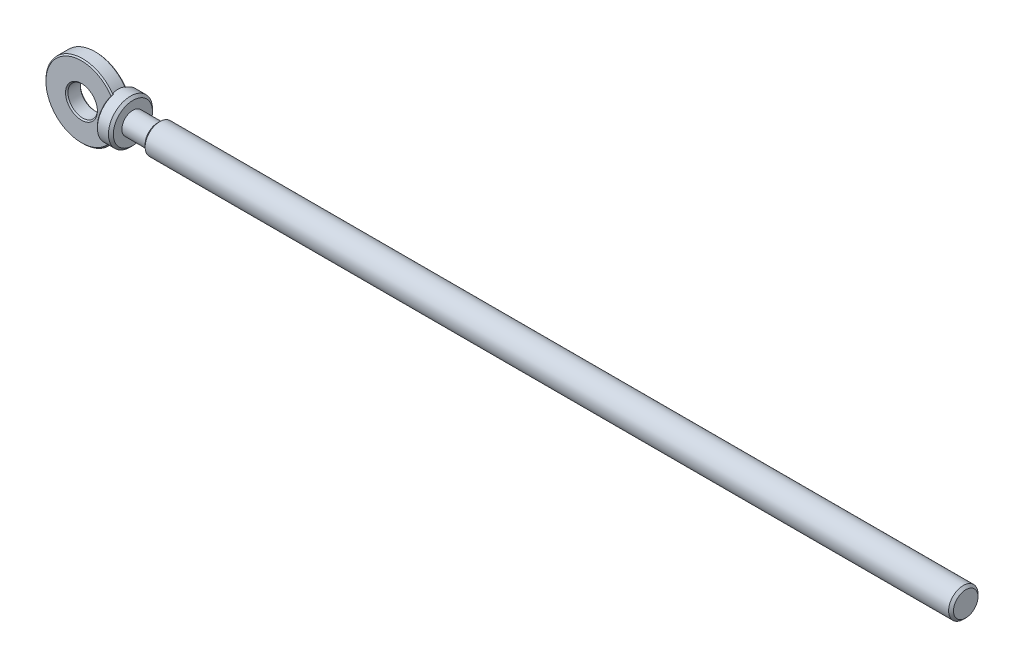
ISO-10303-21;
HEADER;
FILE_DESCRIPTION(('STEP AP214'),'2;1');
FILE_NAME('part.step','',(''),(''),'','','');
FILE_SCHEMA(('AUTOMOTIVE_DESIGN { 1 0 10303 214 1 1 1 1 }'));
ENDSEC;
DATA;
#1=APPLICATION_CONTEXT('core data for automotive mechanical design processes');
#2=APPLICATION_PROTOCOL_DEFINITION('international standard','automotive_design',2000,#1);
#3=PRODUCT_CONTEXT('',#1,'mechanical');
#4=PRODUCT('Part','Part','',(#3));
#5=PRODUCT_RELATED_PRODUCT_CATEGORY('part','',(#4));
#6=PRODUCT_DEFINITION_FORMATION('','',#4);
#7=PRODUCT_DEFINITION_CONTEXT('part definition',#1,'design');
#8=PRODUCT_DEFINITION('design','',#6,#7);
#9=PRODUCT_DEFINITION_SHAPE('','',#8);
#10=(LENGTH_UNIT() NAMED_UNIT(*) SI_UNIT(.MILLI.,.METRE.));
#11=(NAMED_UNIT(*) PLANE_ANGLE_UNIT() SI_UNIT($,.RADIAN.));
#12=(NAMED_UNIT(*) SI_UNIT($,.STERADIAN.) SOLID_ANGLE_UNIT());
#13=UNCERTAINTY_MEASURE_WITH_UNIT(LENGTH_MEASURE(1.E-05),#10,'distance_accuracy_value','');
#14=(GEOMETRIC_REPRESENTATION_CONTEXT(3) GLOBAL_UNCERTAINTY_ASSIGNED_CONTEXT((#13)) GLOBAL_UNIT_ASSIGNED_CONTEXT((#10,
#11,#12)) REPRESENTATION_CONTEXT('',''));
#15=CARTESIAN_POINT('',(0.,0.,0.));
#16=DIRECTION('',(0.,0.,1.));
#17=DIRECTION('',(1.,0.,0.));
#18=AXIS2_PLACEMENT_3D('',#15,#16,#17);
#19=CARTESIAN_POINT('',(0.,0.,3.));
#20=DIRECTION('',(0.,0.,1.));
#21=DIRECTION('',(1.,0.,0.));
#22=AXIS2_PLACEMENT_3D('',#19,#20,#21);
#23=PLANE('',#22);
#24=CARTESIAN_POINT('',(0.,0.,3.));
#25=DIRECTION('',(0.,0.,1.));
#26=DIRECTION('',(1.,0.,0.));
#27=AXIS2_PLACEMENT_3D('',#24,#25,#26);
#28=CIRCLE('',#27,6.50000000000001);
#29=CARTESIAN_POINT('',(6.50000000000001,0.,3.));
#30=VERTEX_POINT('',#29);
#31=EDGE_CURVE('E291',#30,#30,#28,.F.);
#32=ORIENTED_EDGE('',*,*,#31,.T.);
#33=EDGE_LOOP('',(#32));
#34=FACE_BOUND('',#33,.T.);
#35=CARTESIAN_POINT('',(0.,0.,3.));
#36=DIRECTION('',(0.,0.,1.));
#37=DIRECTION('',(1.,0.,0.));
#38=AXIS2_PLACEMENT_3D('',#35,#36,#37);
#39=CIRCLE('',#38,14.5000000000001);
#40=CARTESIAN_POINT('',(12.0729114110313,8.03086608414009,3.));
#41=VERTEX_POINT('',#40);
#42=CARTESIAN_POINT('',(12.0729114110313,-8.03086608414009,3.));
#43=VERTEX_POINT('',#42);
#44=EDGE_CURVE('E138',#41,#43,#39,.T.);
#45=ORIENTED_EDGE('',*,*,#44,.T.);
#46=CARTESIAN_POINT('',(12.,-7.95298686029347,3.));
#47=CARTESIAN_POINT('',(12.2835730188533,-8.25599915961362,3.));
#48=CARTESIAN_POINT('',(12.5681529925396,-8.55806429914531,3.));
#49=CARTESIAN_POINT('',(13.138904051181,-9.16068236188235,3.));
#50=CARTESIAN_POINT('',(13.4250751195812,-9.46123530076007,3.));
#51=CARTESIAN_POINT('',(13.9985830405631,-10.0612085177763,3.));
#52=CARTESIAN_POINT('',(14.2859198586009,-10.3606288289764,3.));
#53=CARTESIAN_POINT('',(14.8615144995009,-10.9585843048844,3.));
#54=CARTESIAN_POINT('',(15.149772325117,-11.2571194669404,3.));
#55=CARTESIAN_POINT('',(16.0156071054011,-12.1516678805662,3.));
#56=CARTESIAN_POINT('',(16.5942601284173,-12.7466394617818,3.));
#57=CARTESIAN_POINT('',(17.4636529352792,-13.637732696402,3.));
#58=CARTESIAN_POINT('',(17.7536903781834,-13.9345407931431,3.));
#59=CARTESIAN_POINT('',(18.3341611916546,-14.5277695303177,3.));
#60=CARTESIAN_POINT('',(18.6245945621705,-14.8241901708012,3.));
#61=CARTESIAN_POINT('',(18.9151897656124,-15.1204522257055,3.));
#62=B_SPLINE_CURVE_WITH_KNOTS('',3,(#46,#47,#48,#49,#50,#51,#52,#53,#54,#55,#56,#57,#58,#59,#60,
#61),.UNSPECIFIED.,.F.,.F.,(4,2,2,2,2,2,2,4),(0.,1.24501113929316,2.4900093486711,
3.7349709313599,4.97993624011984,7.46980285006694,8.71477294002173,9.95974286957087),.UNSPECIFIED.);
#63=CARTESIAN_POINT('',(12.,-7.95298686029347,3.));
#64=VERTEX_POINT('',#63);
#65=EDGE_CURVE('E220',#43,#64,#62,.F.);
#66=ORIENTED_EDGE('',*,*,#65,.T.);
#67=DIRECTION('',(0.,1.,0.));
#68=VECTOR('',#67,1.);
#69=CARTESIAN_POINT('',(12.,0.,3.));
#70=LINE('',#69,#68);
#71=CARTESIAN_POINT('',(12.,7.95298686029347,3.));
#72=VERTEX_POINT('',#71);
#73=EDGE_CURVE('E253',#64,#72,#70,.T.);
#74=ORIENTED_EDGE('',*,*,#73,.T.);
#75=CARTESIAN_POINT('',(12.,7.95298686029347,3.));
#76=CARTESIAN_POINT('',(12.2835730188533,8.25599915961362,3.));
#77=CARTESIAN_POINT('',(12.5681529925396,8.55806429914531,3.));
#78=CARTESIAN_POINT('',(13.138904051181,9.16068236188235,3.));
#79=CARTESIAN_POINT('',(13.4250751195812,9.46123530076007,3.));
#80=CARTESIAN_POINT('',(13.9985830405631,10.0612085177763,3.));
#81=CARTESIAN_POINT('',(14.2859198586009,10.3606288289764,3.));
#82=CARTESIAN_POINT('',(14.8615144995009,10.9585843048844,3.));
#83=CARTESIAN_POINT('',(15.149772325117,11.2571194669404,3.));
#84=CARTESIAN_POINT('',(16.0156071054011,12.1516678805662,3.));
#85=CARTESIAN_POINT('',(16.5942601284173,12.7466394617818,3.));
#86=CARTESIAN_POINT('',(17.4636529352792,13.637732696402,3.));
#87=CARTESIAN_POINT('',(17.7536903781834,13.9345407931431,3.));
#88=CARTESIAN_POINT('',(18.3341611916546,14.5277695303177,3.));
#89=CARTESIAN_POINT('',(18.6245945621705,14.8241901708012,3.));
#90=CARTESIAN_POINT('',(18.9151897656124,15.1204522257055,3.));
#91=B_SPLINE_CURVE_WITH_KNOTS('',3,(#75,#76,#77,#78,#79,#80,#81,#82,#83,#84,#85,#86,#87,#88,#89,
#90),.UNSPECIFIED.,.F.,.F.,(4,2,2,2,2,2,2,4),(0.,1.24501113929316,2.4900093486711,
3.7349709313599,4.97993624011984,7.46980285006694,8.71477294002173,9.95974286957087),.UNSPECIFIED.);
#92=EDGE_CURVE('E227',#72,#41,#91,.T.);
#93=ORIENTED_EDGE('',*,*,#92,.T.);
#94=EDGE_LOOP('',(#45,#66,#74,#93));
#95=FACE_BOUND('',#94,.T.);
#96=ADVANCED_FACE('F33',(#34,#95),#23,.T.);
#97=CARTESIAN_POINT('',(0.,0.,-3.));
#98=DIRECTION('',(0.,0.,1.));
#99=DIRECTION('',(1.,0.,0.));
#100=AXIS2_PLACEMENT_3D('',#97,#98,#99);
#101=PLANE('',#100);
#102=CARTESIAN_POINT('',(0.,0.,-3.));
#103=DIRECTION('',(0.,0.,1.));
#104=DIRECTION('',(1.,0.,0.));
#105=AXIS2_PLACEMENT_3D('',#102,#103,#104);
#106=CIRCLE('',#105,6.50000000000001);
#107=CARTESIAN_POINT('',(6.50000000000001,0.,-3.));
#108=VERTEX_POINT('',#107);
#109=EDGE_CURVE('E134',#108,#108,#106,.T.);
#110=ORIENTED_EDGE('',*,*,#109,.T.);
#111=EDGE_LOOP('',(#110));
#112=FACE_BOUND('',#111,.T.);
#113=DIRECTION('',(0.,1.,0.));
#114=VECTOR('',#113,1.);
#115=CARTESIAN_POINT('',(12.,0.,-3.));
#116=LINE('',#115,#114);
#117=CARTESIAN_POINT('',(12.,-7.95298686029347,-3.));
#118=VERTEX_POINT('',#117);
#119=CARTESIAN_POINT('',(12.,7.95298686029347,-3.));
#120=VERTEX_POINT('',#119);
#121=EDGE_CURVE('E256',#118,#120,#116,.T.);
#122=ORIENTED_EDGE('',*,*,#121,.F.);
#123=CARTESIAN_POINT('',(12.,-7.95298686029347,-3.));
#124=CARTESIAN_POINT('',(12.2835730188533,-8.25599915961362,-3.));
#125=CARTESIAN_POINT('',(12.5681529925396,-8.55806429914531,-3.));
#126=CARTESIAN_POINT('',(13.138904051181,-9.16068236188235,-3.));
#127=CARTESIAN_POINT('',(13.4250751195812,-9.46123530076007,-3.));
#128=CARTESIAN_POINT('',(13.9985830405631,-10.0612085177763,-3.));
#129=CARTESIAN_POINT('',(14.2859198586009,-10.3606288289764,-3.));
#130=CARTESIAN_POINT('',(14.8615144995009,-10.9585843048844,-3.));
#131=CARTESIAN_POINT('',(15.149772325117,-11.2571194669404,-3.));
#132=CARTESIAN_POINT('',(16.0156071054011,-12.1516678805662,-3.));
#133=CARTESIAN_POINT('',(16.5942601284173,-12.7466394617818,-3.));
#134=CARTESIAN_POINT('',(17.4636529352792,-13.637732696402,-3.));
#135=CARTESIAN_POINT('',(17.7536903781834,-13.9345407931431,-3.));
#136=CARTESIAN_POINT('',(18.3341611916546,-14.5277695303177,-3.));
#137=CARTESIAN_POINT('',(18.6245945621705,-14.8241901708012,-3.));
#138=CARTESIAN_POINT('',(18.9151897656124,-15.1204522257055,-3.));
#139=B_SPLINE_CURVE_WITH_KNOTS('',3,(#123,#124,#125,#126,#127,#128,#129,#130,#131,#132,#133,
#134,#135,#136,#137,#138),.UNSPECIFIED.,.F.,.F.,(4,2,2,2,2,2,2,4),(0.,1.24501113929316,
2.4900093486711,3.7349709313599,4.97993624011984,7.46980285006694,8.71477294002173,
9.95974286957087),.UNSPECIFIED.);
#140=CARTESIAN_POINT('',(12.0729114110313,-8.03086608414009,-3.));
#141=VERTEX_POINT('',#140);
#142=EDGE_CURVE('E335',#118,#141,#139,.T.);
#143=ORIENTED_EDGE('',*,*,#142,.T.);
#144=CARTESIAN_POINT('',(0.,0.,-3.));
#145=DIRECTION('',(0.,0.,1.));
#146=DIRECTION('',(1.,0.,0.));
#147=AXIS2_PLACEMENT_3D('',#144,#145,#146);
#148=CIRCLE('',#147,14.5000000000001);
#149=CARTESIAN_POINT('',(12.0729114110313,8.03086608414009,-3.));
#150=VERTEX_POINT('',#149);
#151=EDGE_CURVE('E53',#141,#150,#148,.F.);
#152=ORIENTED_EDGE('',*,*,#151,.T.);
#153=CARTESIAN_POINT('',(12.,7.95298686029347,-3.));
#154=CARTESIAN_POINT('',(12.2835730188533,8.25599915961362,-3.));
#155=CARTESIAN_POINT('',(12.5681529925396,8.55806429914531,-3.));
#156=CARTESIAN_POINT('',(13.138904051181,9.16068236188235,-3.));
#157=CARTESIAN_POINT('',(13.4250751195812,9.46123530076007,-3.));
#158=CARTESIAN_POINT('',(13.9985830405631,10.0612085177763,-3.));
#159=CARTESIAN_POINT('',(14.2859198586009,10.3606288289764,-3.));
#160=CARTESIAN_POINT('',(14.8615144995009,10.9585843048844,-3.));
#161=CARTESIAN_POINT('',(15.149772325117,11.2571194669404,-3.));
#162=CARTESIAN_POINT('',(16.0156071054011,12.1516678805662,-3.));
#163=CARTESIAN_POINT('',(16.5942601284173,12.7466394617818,-3.));
#164=CARTESIAN_POINT('',(17.4636529352792,13.637732696402,-3.));
#165=CARTESIAN_POINT('',(17.7536903781834,13.9345407931431,-3.));
#166=CARTESIAN_POINT('',(18.3341611916546,14.5277695303177,-3.));
#167=CARTESIAN_POINT('',(18.6245945621705,14.8241901708012,-3.));
#168=CARTESIAN_POINT('',(18.9151897656124,15.1204522257055,-3.));
#169=B_SPLINE_CURVE_WITH_KNOTS('',3,(#153,#154,#155,#156,#157,#158,#159,#160,#161,#162,#163,
#164,#165,#166,#167,#168),.UNSPECIFIED.,.F.,.F.,(4,2,2,2,2,2,2,4),(0.,1.24501113929316,
2.4900093486711,3.7349709313599,4.97993624011984,7.46980285006694,8.71477294002173,
9.95974286957087),.UNSPECIFIED.);
#170=EDGE_CURVE('E247',#150,#120,#169,.F.);
#171=ORIENTED_EDGE('',*,*,#170,.T.);
#172=EDGE_LOOP('',(#122,#143,#152,#171));
#173=FACE_BOUND('',#172,.T.);
#174=ADVANCED_FACE('F283',(#112,#173),#101,.F.);
#175=CARTESIAN_POINT('',(0.,0.,3.));
#176=DIRECTION('',(0.,0.,-1.));
#177=DIRECTION('',(-1.,0.,0.));
#178=AXIS2_PLACEMENT_3D('',#175,#176,#177);
#179=CYLINDRICAL_SURFACE('',#178,15.);
#180=CARTESIAN_POINT('',(12.369316876853,-8.48528137423857,3.));
#181=CARTESIAN_POINT('',(12.3221628555619,-8.55399265261305,2.80571556477594));
#182=CARTESIAN_POINT('',(12.2786023029932,-8.61628897871856,2.60822104624012));
#183=CARTESIAN_POINT('',(12.199824844019,-8.72748813543671,2.20773112430477));
#184=CARTESIAN_POINT('',(12.1646135994721,-8.7763818809356,2.00473209153101));
#185=CARTESIAN_POINT('',(12.1038014122272,-8.86005860158778,1.59470774795942));
#186=CARTESIAN_POINT('',(12.0781869679905,-8.89486140659758,1.38768852795889));
#187=CARTESIAN_POINT('',(12.0374151767847,-8.94996230436033,0.970757302326721));
#188=CARTESIAN_POINT('',(12.0222549302426,-8.97026441907619,0.76084611529875));
#189=CARTESIAN_POINT('',(12.0029189827223,-8.99612137426369,0.338691212867915));
#190=CARTESIAN_POINT('',(11.9987910945967,-9.00161202466861,0.126441334819026));
#191=CARTESIAN_POINT('',(12.0018208961828,-8.99757196060952,-0.29783522068331));
#192=CARTESIAN_POINT('',(12.0089786680204,-8.98804113683408,-0.509861896501276));
#193=CARTESIAN_POINT('',(12.0342847045353,-8.95412947896075,-0.931843213909112));
#194=CARTESIAN_POINT('',(12.052422292186,-8.92976307119487,-1.14179966731187));
#195=CARTESIAN_POINT('',(12.0989847192112,-8.86657192779871,-1.55828562884046));
#196=CARTESIAN_POINT('',(12.1274060290411,-8.82775215267245,-1.76481628735148));
#197=CARTESIAN_POINT('',(12.1889463119389,-8.74253723123575,-2.14488592384717));
#198=CARTESIAN_POINT('',(12.2208673858972,-8.69793896895719,-2.31902849990492));
#199=CARTESIAN_POINT('',(12.2907533363521,-8.59889455083059,-2.66289383591663));
#200=CARTESIAN_POINT('',(12.3287068351335,-8.54446690829363,-2.83262423005837));
#201=CARTESIAN_POINT('',(12.369316876853,-8.48528137423857,-3.));
#202=B_SPLINE_CURVE_WITH_KNOTS('',3,(#180,#181,#182,#183,#184,#185,#186,#187,#188,#189,#190,
#191,#192,#193,#194,#195,#196,#197,#198,#199,#200,#201),.UNSPECIFIED.,.F.,.F.,(4,2,2,2,2,2,2,2,
2,2,4),(0.,0.63415362311398,1.2687360584299,1.90242233026116,2.53593277229428,3.17218435016263,
3.80844055806214,4.44407904736948,5.07949958157878,5.62680886083841,6.1730978527989),.UNSPECIFIED.);
#203=CARTESIAN_POINT('',(12.2576506721313,-8.64580823289528,2.50000000000002));
#204=VERTEX_POINT('',#203);
#205=CARTESIAN_POINT('',(12.2576506721313,-8.64580823289529,-2.50000000000001));
#206=VERTEX_POINT('',#205);
#207=EDGE_CURVE('E113',#204,#206,#202,.T.);
#208=ORIENTED_EDGE('',*,*,#207,.F.);
#209=CARTESIAN_POINT('',(0.,0.,2.50000000000002));
#210=DIRECTION('',(0.,0.,1.));
#211=DIRECTION('',(1.,0.,0.));
#212=AXIS2_PLACEMENT_3D('',#209,#210,#211);
#213=CIRCLE('',#212,15.);
#214=CARTESIAN_POINT('',(12.2576506721313,8.64580823289529,2.50000000000002));
#215=VERTEX_POINT('',#214);
#216=EDGE_CURVE('E126',#204,#215,#213,.F.);
#217=ORIENTED_EDGE('',*,*,#216,.T.);
#218=CARTESIAN_POINT('',(12.369316876853,8.48528137423857,-3.));
#219=CARTESIAN_POINT('',(12.3221628555619,8.55399265261305,-2.80571556477594));
#220=CARTESIAN_POINT('',(12.2786023029932,8.61628897871856,-2.60822104624012));
#221=CARTESIAN_POINT('',(12.199824844019,8.72748813543671,-2.20773112430477));
#222=CARTESIAN_POINT('',(12.1646135994721,8.7763818809356,-2.00473209153101));
#223=CARTESIAN_POINT('',(12.1038014122272,8.86005860158778,-1.59470774795942));
#224=CARTESIAN_POINT('',(12.0781869679905,8.89486140659758,-1.38768852795889));
#225=CARTESIAN_POINT('',(12.0374151767847,8.94996230436033,-0.970757302326721));
#226=CARTESIAN_POINT('',(12.0222549302426,8.97026441907619,-0.76084611529875));
#227=CARTESIAN_POINT('',(12.0029189827223,8.99612137426369,-0.338691212867915));
#228=CARTESIAN_POINT('',(11.9987910945967,9.00161202466861,-0.126441334819026));
#229=CARTESIAN_POINT('',(12.0018208961828,8.99757196060952,0.29783522068331));
#230=CARTESIAN_POINT('',(12.0089786680204,8.98804113683408,0.509861896501276));
#231=CARTESIAN_POINT('',(12.0342847045353,8.95412947896075,0.931843213909112));
#232=CARTESIAN_POINT('',(12.052422292186,8.92976307119487,1.14179966731187));
#233=CARTESIAN_POINT('',(12.0989847192112,8.86657192779871,1.55828562884046));
#234=CARTESIAN_POINT('',(12.1274060290411,8.82775215267245,1.76481628735148));
#235=CARTESIAN_POINT('',(12.1889463119389,8.74253723123575,2.14488592384717));
#236=CARTESIAN_POINT('',(12.2208673858972,8.69793896895719,2.31902849990492));
#237=CARTESIAN_POINT('',(12.2907533363521,8.59889455083059,2.66289383591663));
#238=CARTESIAN_POINT('',(12.3287068351335,8.54446690829363,2.83262423005837));
#239=CARTESIAN_POINT('',(12.369316876853,8.48528137423857,3.));
#240=B_SPLINE_CURVE_WITH_KNOTS('',3,(#218,#219,#220,#221,#222,#223,#224,#225,#226,#227,#228,
#229,#230,#231,#232,#233,#234,#235,#236,#237,#238,#239),.UNSPECIFIED.,.F.,.F.,(4,2,2,2,2,2,2,2,
2,2,4),(0.,0.63415362311398,1.2687360584299,1.90242233026116,2.53593277229428,3.17218435016263,
3.80844055806214,4.44407904736948,5.07949958157878,5.62680886083841,6.1730978527989),.UNSPECIFIED.);
#241=CARTESIAN_POINT('',(12.2576506721313,8.64580823289529,-2.50000000000001));
#242=VERTEX_POINT('',#241);
#243=EDGE_CURVE('E129',#242,#215,#240,.T.);
#244=ORIENTED_EDGE('',*,*,#243,.F.);
#245=CARTESIAN_POINT('',(0.,0.,-2.50000000000001));
#246=DIRECTION('',(0.,0.,1.));
#247=DIRECTION('',(1.,0.,0.));
#248=AXIS2_PLACEMENT_3D('',#245,#246,#247);
#249=CIRCLE('',#248,15.);
#250=EDGE_CURVE('E127',#242,#206,#249,.T.);
#251=ORIENTED_EDGE('',*,*,#250,.T.);
#252=EDGE_LOOP('',(#208,#217,#244,#251));
#253=FACE_BOUND('',#252,.T.);
#254=ADVANCED_FACE('F124',(#253),#179,.T.);
#255=CARTESIAN_POINT('',(0.,0.,3.));
#256=DIRECTION('',(0.,0.,-1.));
#257=DIRECTION('',(-1.,0.,0.));
#258=AXIS2_PLACEMENT_3D('',#255,#256,#257);
#259=CYLINDRICAL_SURFACE('',#258,6.);
#260=CARTESIAN_POINT('',(0.,0.,2.49999999999997));
#261=DIRECTION('',(0.,0.,1.));
#262=DIRECTION('',(1.,0.,0.));
#263=AXIS2_PLACEMENT_3D('',#260,#261,#262);
#264=CIRCLE('',#263,6.);
#265=CARTESIAN_POINT('',(6.,0.,2.49999999999997));
#266=VERTEX_POINT('',#265);
#267=EDGE_CURVE('E146',#266,#266,#264,.T.);
#268=ORIENTED_EDGE('',*,*,#267,.T.);
#269=EDGE_LOOP('',(#268));
#270=FACE_BOUND('',#269,.T.);
#271=CARTESIAN_POINT('',(0.,0.,-2.50000000000002));
#272=DIRECTION('',(0.,0.,1.));
#273=DIRECTION('',(1.,0.,0.));
#274=AXIS2_PLACEMENT_3D('',#271,#272,#273);
#275=CIRCLE('',#274,6.);
#276=CARTESIAN_POINT('',(6.,0.,-2.50000000000002));
#277=VERTEX_POINT('',#276);
#278=EDGE_CURVE('E143',#277,#277,#275,.F.);
#279=ORIENTED_EDGE('',*,*,#278,.T.);
#280=EDGE_LOOP('',(#279));
#281=FACE_BOUND('',#280,.T.);
#282=ADVANCED_FACE('F327',(#270,#281),#259,.F.);
#283=CARTESIAN_POINT('',(12.,0.,0.));
#284=DIRECTION('',(1.,0.,0.));
#285=DIRECTION('',(0.,0.,-1.));
#286=AXIS2_PLACEMENT_3D('',#283,#284,#285);
#287=PLANE('',#286);
#288=ORIENTED_EDGE('',*,*,#121,.T.);
#289=CARTESIAN_POINT('',(12.,0.,0.));
#290=DIRECTION('',(1.,0.,0.));
#291=DIRECTION('',(0.,0.,-1.));
#292=AXIS2_PLACEMENT_3D('',#289,#290,#291);
#293=CIRCLE('',#292,8.50000000000003);
#294=EDGE_CURVE('E217',#120,#118,#293,.F.);
#295=ORIENTED_EDGE('',*,*,#294,.T.);
#296=EDGE_LOOP('',(#288,#295));
#297=FACE_BOUND('',#296,.T.);
#298=ADVANCED_FACE('F168',(#297),#287,.F.);
#299=CARTESIAN_POINT('',(-15.,0.,0.));
#300=DIRECTION('',(-1.,0.,0.));
#301=DIRECTION('',(0.,0.,1.));
#302=AXIS2_PLACEMENT_3D('',#299,#300,#301);
#303=CYLINDRICAL_SURFACE('',#302,9.);
#304=CARTESIAN_POINT('',(16.9999999999999,0.,0.));
#305=DIRECTION('',(-1.,0.,0.));
#306=DIRECTION('',(0.,0.,1.));
#307=AXIS2_PLACEMENT_3D('',#304,#305,#306);
#308=CIRCLE('',#307,9.);
#309=CARTESIAN_POINT('',(16.9999999999999,0.,9.));
#310=VERTEX_POINT('',#309);
#311=EDGE_CURVE('E263',#310,#310,#308,.T.);
#312=ORIENTED_EDGE('',*,*,#311,.T.);
#313=EDGE_LOOP('',(#312));
#314=FACE_BOUND('',#313,.T.);
#315=ORIENTED_EDGE('',*,*,#243,.T.);
#316=CARTESIAN_POINT('',(12.5,8.7104716001424,2.2644391144636));
#317=CARTESIAN_POINT('',(12.3938248537652,8.6838676161721,2.36676089310342));
#318=CARTESIAN_POINT('',(12.2884671347018,8.655262333074,2.46940638238641));
#319=CARTESIAN_POINT('',(12.0796156609199,8.59383475884252,2.67536275909698));
#320=CARTESIAN_POINT('',(11.9761222094995,8.5610117884726,2.77867375114921));
#321=CARTESIAN_POINT('',(11.6700683906366,8.45633094038508,3.08833241912403));
#322=CARTESIAN_POINT('',(11.470648073195,8.37794496493001,3.29564002154209));
#323=CARTESIAN_POINT('',(11.0827576913241,8.20171904544879,3.71255099359621));
#324=CARTESIAN_POINT('',(10.8942921538535,8.10387113178587,3.92215527038145));
#325=CARTESIAN_POINT('',(10.621921120078,7.9405635875128,4.23811299076778));
#326=CARTESIAN_POINT('',(10.5326035757586,7.88317755613287,4.34400591341861));
#327=CARTESIAN_POINT('',(10.3580906440943,7.76260691634443,4.55596196467909));
#328=CARTESIAN_POINT('',(10.2728968383347,7.69942010964792,4.66202514272461));
#329=CARTESIAN_POINT('',(10.1900273551833,7.63318956823422,4.76806218661211));
#330=B_SPLINE_CURVE_WITH_KNOTS('',3,(#316,#317,#318,#319,#320,#321,#322,#323,#324,#325,#326,
#327,#328,#329),.UNSPECIFIED.,.F.,.F.,(4,2,2,2,2,2,4),(0.,0.449479872110191,0.899032221544185,
1.7927152217836,2.68676494023106,3.13645457596968,3.58631533719687),.UNSPECIFIED.);
#331=CARTESIAN_POINT('',(12.5,8.7104716001424,2.2644391144636));
#332=VERTEX_POINT('',#331);
#333=EDGE_CURVE('E133',#215,#332,#330,.F.);
#334=ORIENTED_EDGE('',*,*,#333,.T.);
#335=CARTESIAN_POINT('',(12.5,0.,0.));
#336=DIRECTION('',(1.,0.,0.));
#337=DIRECTION('',(0.,0.,-1.));
#338=AXIS2_PLACEMENT_3D('',#335,#336,#337);
#339=CIRCLE('',#338,9.);
#340=CARTESIAN_POINT('',(12.5,-8.42080961678128,3.17647058823529));
#341=VERTEX_POINT('',#340);
#342=EDGE_CURVE('E218',#332,#341,#339,.T.);
#343=ORIENTED_EDGE('',*,*,#342,.T.);
#344=CARTESIAN_POINT('',(12.5,0.,0.));
#345=DIRECTION('',(1.,0.,0.));
#346=DIRECTION('',(0.,0.,-1.));
#347=AXIS2_PLACEMENT_3D('',#344,#345,#346);
#348=CIRCLE('',#347,9.);
#349=CARTESIAN_POINT('',(12.5,-8.7104716001424,2.2644391144636));
#350=VERTEX_POINT('',#349);
#351=EDGE_CURVE('E116',#341,#350,#348,.T.);
#352=ORIENTED_EDGE('',*,*,#351,.T.);
#353=CARTESIAN_POINT('',(12.5,-8.7104716001424,2.2644391144636));
#354=CARTESIAN_POINT('',(12.3938248537652,-8.6838676161721,2.36676089310342));
#355=CARTESIAN_POINT('',(12.2884671347018,-8.655262333074,2.46940638238641));
#356=CARTESIAN_POINT('',(12.0796156609199,-8.59383475884252,2.67536275909698));
#357=CARTESIAN_POINT('',(11.9761222094995,-8.5610117884726,2.77867375114921));
#358=CARTESIAN_POINT('',(11.6700683906366,-8.45633094038508,3.08833241912403));
#359=CARTESIAN_POINT('',(11.470648073195,-8.37794496493001,3.29564002154209));
#360=CARTESIAN_POINT('',(11.0827576913241,-8.20171904544879,3.71255099359621));
#361=CARTESIAN_POINT('',(10.8942921538535,-8.10387113178587,3.92215527038145));
#362=CARTESIAN_POINT('',(10.621921120078,-7.9405635875128,4.23811299076778));
#363=CARTESIAN_POINT('',(10.5326035757586,-7.88317755613287,4.34400591341861));
#364=CARTESIAN_POINT('',(10.3580906440943,-7.76260691634443,4.55596196467909));
#365=CARTESIAN_POINT('',(10.2728968383347,-7.69942010964792,4.66202514272461));
#366=CARTESIAN_POINT('',(10.1900273551833,-7.63318956823422,4.76806218661211));
#367=B_SPLINE_CURVE_WITH_KNOTS('',3,(#353,#354,#355,#356,#357,#358,#359,#360,#361,#362,#363,
#364,#365,#366),.UNSPECIFIED.,.F.,.F.,(4,2,2,2,2,2,4),(0.,0.449479872110191,0.899032221544185,
1.7927152217836,2.68676494023106,3.13645457596968,3.58631533719687),.UNSPECIFIED.);
#368=EDGE_CURVE('E109',#350,#204,#367,.T.);
#369=ORIENTED_EDGE('',*,*,#368,.T.);
#370=ORIENTED_EDGE('',*,*,#207,.T.);
#371=CARTESIAN_POINT('',(12.4999999999998,-8.71047160014236,-2.26443911446374));
#372=CARTESIAN_POINT('',(12.393824853765,-8.68386761617206,-2.36676089310356));
#373=CARTESIAN_POINT('',(12.2884671347017,-8.65526233307396,-2.46940638238655));
#374=CARTESIAN_POINT('',(12.0796156609198,-8.59383475884248,-2.67536275909711));
#375=CARTESIAN_POINT('',(11.9761222094994,-8.56101178847256,-2.77867375114934));
#376=CARTESIAN_POINT('',(11.6700683906365,-8.45633094038504,-3.08833241912414));
#377=CARTESIAN_POINT('',(11.4706480731949,-8.37794496492997,-3.29564002154219));
#378=CARTESIAN_POINT('',(11.082757691324,-8.20171904544875,-3.7125509935963));
#379=CARTESIAN_POINT('',(10.8942921538535,-8.10387113178583,-3.92215527038153));
#380=CARTESIAN_POINT('',(10.621921120078,-7.94056358751277,-4.23811299076785));
#381=CARTESIAN_POINT('',(10.5326035757586,-7.88317755613284,-4.34400591341867));
#382=CARTESIAN_POINT('',(10.3580906440943,-7.7626069163444,-4.55596196467914));
#383=CARTESIAN_POINT('',(10.2728968383347,-7.69942010964789,-4.66202514272466));
#384=CARTESIAN_POINT('',(10.1900273551833,-7.6331895682342,-4.76806218661215));
#385=B_SPLINE_CURVE_WITH_KNOTS('',3,(#371,#372,#373,#374,#375,#376,#377,#378,#379,#380,#381,
#382,#383,#384),.UNSPECIFIED.,.F.,.F.,(4,2,2,2,2,2,4),(0.,0.449479872110169,0.899032221544143,
1.79271522178351,2.68676494023093,3.13645457596952,3.58631533719669),.UNSPECIFIED.);
#386=CARTESIAN_POINT('',(12.4999999999999,-8.71047160014224,-2.26443911446377));
#387=VERTEX_POINT('',#386);
#388=EDGE_CURVE('E60',#206,#387,#385,.F.);
#389=ORIENTED_EDGE('',*,*,#388,.T.);
#390=CARTESIAN_POINT('',(12.5,0.,0.));
#391=DIRECTION('',(1.,0.,0.));
#392=DIRECTION('',(0.,0.,-1.));
#393=AXIS2_PLACEMENT_3D('',#390,#391,#392);
#394=CIRCLE('',#393,9.);
#395=CARTESIAN_POINT('',(12.5,8.42080961678128,-3.17647058823529));
#396=VERTEX_POINT('',#395);
#397=EDGE_CURVE('E346',#387,#396,#394,.T.);
#398=ORIENTED_EDGE('',*,*,#397,.T.);
#399=CARTESIAN_POINT('',(12.5,0.,0.));
#400=DIRECTION('',(1.,0.,0.));
#401=DIRECTION('',(0.,0.,-1.));
#402=AXIS2_PLACEMENT_3D('',#399,#400,#401);
#403=CIRCLE('',#402,9.);
#404=CARTESIAN_POINT('',(12.4999999999998,8.71047160014236,-2.26443911446374));
#405=VERTEX_POINT('',#404);
#406=EDGE_CURVE('E157',#396,#405,#403,.T.);
#407=ORIENTED_EDGE('',*,*,#406,.T.);
#408=CARTESIAN_POINT('',(12.4999999999998,8.71047160014236,-2.26443911446374));
#409=CARTESIAN_POINT('',(12.393824853765,8.68386761617206,-2.36676089310356));
#410=CARTESIAN_POINT('',(12.2884671347017,8.65526233307396,-2.46940638238655));
#411=CARTESIAN_POINT('',(12.0796156609198,8.59383475884248,-2.67536275909711));
#412=CARTESIAN_POINT('',(11.9761222094994,8.56101178847256,-2.77867375114934));
#413=CARTESIAN_POINT('',(11.6700683906365,8.45633094038504,-3.08833241912414));
#414=CARTESIAN_POINT('',(11.4706480731949,8.37794496492997,-3.29564002154219));
#415=CARTESIAN_POINT('',(11.082757691324,8.20171904544875,-3.7125509935963));
#416=CARTESIAN_POINT('',(10.8942921538535,8.10387113178583,-3.92215527038153));
#417=CARTESIAN_POINT('',(10.621921120078,7.94056358751277,-4.23811299076785));
#418=CARTESIAN_POINT('',(10.5326035757586,7.88317755613284,-4.34400591341867));
#419=CARTESIAN_POINT('',(10.3580906440943,7.7626069163444,-4.55596196467914));
#420=CARTESIAN_POINT('',(10.2728968383347,7.69942010964789,-4.66202514272466));
#421=CARTESIAN_POINT('',(10.1900273551833,7.6331895682342,-4.76806218661215));
#422=B_SPLINE_CURVE_WITH_KNOTS('',3,(#408,#409,#410,#411,#412,#413,#414,#415,#416,#417,#418,
#419,#420,#421),.UNSPECIFIED.,.F.,.F.,(4,2,2,2,2,2,4),(0.,0.449479872110169,0.899032221544143,
1.79271522178351,2.68676494023093,3.13645457596952,3.58631533719669),.UNSPECIFIED.);
#423=EDGE_CURVE('E151',#405,#242,#422,.T.);
#424=ORIENTED_EDGE('',*,*,#423,.T.);
#425=EDGE_LOOP('',(#315,#334,#343,#352,#369,#370,#389,#398,#407,#424));
#426=FACE_BOUND('',#425,.T.);
#427=ADVANCED_FACE('F112',(#314,#426),#303,.T.);
#428=ORIENTED_EDGE('',*,*,#73,.F.);
#429=CARTESIAN_POINT('',(12.,0.,0.));
#430=DIRECTION('',(1.,0.,0.));
#431=DIRECTION('',(0.,0.,-1.));
#432=AXIS2_PLACEMENT_3D('',#429,#430,#431);
#433=CIRCLE('',#432,8.50000000000003);
#434=EDGE_CURVE('E149',#64,#72,#433,.F.);
#435=ORIENTED_EDGE('',*,*,#434,.T.);
#436=EDGE_LOOP('',(#428,#435));
#437=FACE_BOUND('',#436,.T.);
#438=ADVANCED_FACE('F167',(#437),#287,.F.);
#439=CARTESIAN_POINT('',(18.,0.,0.));
#440=DIRECTION('',(-1.,0.,0.));
#441=DIRECTION('',(0.,0.,1.));
#442=AXIS2_PLACEMENT_3D('',#439,#440,#441);
#443=PLANE('',#442);
#444=CARTESIAN_POINT('',(18.,0.,0.));
#445=DIRECTION('',(-1.,0.,0.));
#446=DIRECTION('',(0.,0.,1.));
#447=AXIS2_PLACEMENT_3D('',#444,#445,#446);
#448=CIRCLE('',#447,7.99999999999995);
#449=CARTESIAN_POINT('',(18.,0.,7.99999999999995));
#450=VERTEX_POINT('',#449);
#451=EDGE_CURVE('E307',#450,#450,#448,.F.);
#452=ORIENTED_EDGE('',*,*,#451,.T.);
#453=EDGE_LOOP('',(#452));
#454=FACE_BOUND('',#453,.T.);
#455=CARTESIAN_POINT('',(18.,0.,0.));
#456=DIRECTION('',(1.,0.,0.));
#457=DIRECTION('',(0.,0.,-1.));
#458=AXIS2_PLACEMENT_3D('',#455,#456,#457);
#459=CIRCLE('',#458,4.5);
#460=CARTESIAN_POINT('',(18.,0.,-4.5));
#461=VERTEX_POINT('',#460);
#462=EDGE_CURVE('E128',#461,#461,#459,.T.);
#463=ORIENTED_EDGE('',*,*,#462,.F.);
#464=EDGE_LOOP('',(#463));
#465=FACE_BOUND('',#464,.T.);
#466=ADVANCED_FACE('F170',(#454,#465),#443,.F.);
#467=CARTESIAN_POINT('',(28.,0.,0.));
#468=DIRECTION('',(-1.,0.,0.));
#469=DIRECTION('',(0.,0.,1.));
#470=AXIS2_PLACEMENT_3D('',#467,#468,#469);
#471=CYLINDRICAL_SURFACE('',#470,4.5);
#472=CARTESIAN_POINT('',(28.,0.,0.));
#473=DIRECTION('',(1.,0.,0.));
#474=DIRECTION('',(0.,0.,-1.));
#475=AXIS2_PLACEMENT_3D('',#472,#473,#474);
#476=CIRCLE('',#475,4.5);
#477=CARTESIAN_POINT('',(28.,0.,-4.5));
#478=VERTEX_POINT('',#477);
#479=EDGE_CURVE('E258',#478,#478,#476,.T.);
#480=ORIENTED_EDGE('',*,*,#479,.F.);
#481=EDGE_LOOP('',(#480));
#482=FACE_BOUND('',#481,.T.);
#483=ORIENTED_EDGE('',*,*,#462,.T.);
#484=EDGE_LOOP('',(#483));
#485=FACE_BOUND('',#484,.T.);
#486=ADVANCED_FACE('F269',(#482,#485),#471,.T.);
#487=CARTESIAN_POINT('',(358.,0.,0.));
#488=DIRECTION('',(-1.,0.,0.));
#489=DIRECTION('',(0.,0.,1.));
#490=AXIS2_PLACEMENT_3D('',#487,#488,#489);
#491=CYLINDRICAL_SURFACE('',#490,6.);
#492=CARTESIAN_POINT('',(29.,0.,0.));
#493=DIRECTION('',(1.,0.,0.));
#494=DIRECTION('',(0.,0.,-1.));
#495=AXIS2_PLACEMENT_3D('',#492,#493,#494);
#496=CIRCLE('',#495,6.);
#497=CARTESIAN_POINT('',(29.,0.,-6.));
#498=VERTEX_POINT('',#497);
#499=EDGE_CURVE('E301',#498,#498,#496,.T.);
#500=ORIENTED_EDGE('',*,*,#499,.T.);
#501=EDGE_LOOP('',(#500));
#502=FACE_BOUND('',#501,.T.);
#503=CARTESIAN_POINT('',(357.,0.,0.));
#504=DIRECTION('',(1.,0.,0.));
#505=DIRECTION('',(0.,0.,-1.));
#506=AXIS2_PLACEMENT_3D('',#503,#504,#505);
#507=CIRCLE('',#506,6.);
#508=CARTESIAN_POINT('',(357.,0.,-6.));
#509=VERTEX_POINT('',#508);
#510=EDGE_CURVE('E304',#509,#509,#507,.F.);
#511=ORIENTED_EDGE('',*,*,#510,.T.);
#512=EDGE_LOOP('',(#511));
#513=FACE_BOUND('',#512,.T.);
#514=ADVANCED_FACE('F272',(#502,#513),#491,.T.);
#515=CARTESIAN_POINT('',(358.,0.,0.));
#516=DIRECTION('',(1.,0.,0.));
#517=DIRECTION('',(0.,0.,-1.));
#518=AXIS2_PLACEMENT_3D('',#515,#516,#517);
#519=PLANE('',#518);
#520=CARTESIAN_POINT('',(358.,0.,0.));
#521=DIRECTION('',(1.,0.,0.));
#522=DIRECTION('',(0.,0.,-1.));
#523=AXIS2_PLACEMENT_3D('',#520,#521,#522);
#524=CIRCLE('',#523,4.99999999999989);
#525=CARTESIAN_POINT('',(358.,0.,-4.99999999999989));
#526=VERTEX_POINT('',#525);
#527=EDGE_CURVE('E293',#526,#526,#524,.T.);
#528=ORIENTED_EDGE('',*,*,#527,.T.);
#529=EDGE_LOOP('',(#528));
#530=FACE_BOUND('',#529,.T.);
#531=ADVANCED_FACE('F321',(#530),#519,.T.);
#532=CARTESIAN_POINT('',(28.,0.,0.));
#533=DIRECTION('',(1.,0.,0.));
#534=DIRECTION('',(0.,0.,-1.));
#535=AXIS2_PLACEMENT_3D('',#532,#533,#534);
#536=PLANE('',#535);
#537=CARTESIAN_POINT('',(28.,0.,0.));
#538=DIRECTION('',(1.,0.,0.));
#539=DIRECTION('',(0.,0.,-1.));
#540=AXIS2_PLACEMENT_3D('',#537,#538,#539);
#541=CIRCLE('',#540,5.00000000000004);
#542=CARTESIAN_POINT('',(28.,0.,-5.00000000000004));
#543=VERTEX_POINT('',#542);
#544=EDGE_CURVE('E296',#543,#543,#541,.F.);
#545=ORIENTED_EDGE('',*,*,#544,.T.);
#546=EDGE_LOOP('',(#545));
#547=FACE_BOUND('',#546,.T.);
#548=ORIENTED_EDGE('',*,*,#479,.T.);
#549=EDGE_LOOP('',(#548));
#550=FACE_BOUND('',#549,.T.);
#551=ADVANCED_FACE('F267',(#547,#550),#536,.F.);
#552=CARTESIAN_POINT('',(16.9999999999999,0.,0.));
#553=DIRECTION('',(-1.,0.,0.));
#554=DIRECTION('',(0.,0.,1.));
#555=AXIS2_PLACEMENT_3D('',#552,#553,#554);
#556=CONICAL_SURFACE('',#555,9.,0.785398163397437);
#557=ORIENTED_EDGE('',*,*,#451,.F.);
#558=EDGE_LOOP('',(#557));
#559=FACE_BOUND('',#558,.T.);
#560=ORIENTED_EDGE('',*,*,#311,.F.);
#561=EDGE_LOOP('',(#560));
#562=FACE_BOUND('',#561,.T.);
#563=ADVANCED_FACE('F311',(#559,#562),#556,.T.);
#564=CARTESIAN_POINT('',(29.,0.,0.));
#565=DIRECTION('',(1.,0.,0.));
#566=DIRECTION('',(0.,0.,-1.));
#567=AXIS2_PLACEMENT_3D('',#564,#565,#566);
#568=CONICAL_SURFACE('',#567,6.,0.785398163397446);
#569=ORIENTED_EDGE('',*,*,#544,.F.);
#570=EDGE_LOOP('',(#569));
#571=FACE_BOUND('',#570,.T.);
#572=ORIENTED_EDGE('',*,*,#499,.F.);
#573=EDGE_LOOP('',(#572));
#574=FACE_BOUND('',#573,.T.);
#575=ADVANCED_FACE('F313',(#571,#574),#568,.T.);
#576=CARTESIAN_POINT('',(358.,0.,0.));
#577=DIRECTION('',(-1.,0.,0.));
#578=DIRECTION('',(0.,0.,1.));
#579=AXIS2_PLACEMENT_3D('',#576,#577,#578);
#580=CONICAL_SURFACE('',#579,4.99999999999989,0.785398163397474);
#581=ORIENTED_EDGE('',*,*,#510,.F.);
#582=EDGE_LOOP('',(#581));
#583=FACE_BOUND('',#582,.T.);
#584=ORIENTED_EDGE('',*,*,#527,.F.);
#585=EDGE_LOOP('',(#584));
#586=FACE_BOUND('',#585,.T.);
#587=ADVANCED_FACE('F201',(#583,#586),#580,.T.);
#588=CARTESIAN_POINT('',(0.,0.,3.));
#589=DIRECTION('',(0.,0.,-1.));
#590=DIRECTION('',(-1.,0.,0.));
#591=AXIS2_PLACEMENT_3D('',#588,#589,#590);
#592=CONICAL_SURFACE('',#591,14.5000000000001,0.785398163397396);
#593=ORIENTED_EDGE('',*,*,#44,.F.);
#594=CARTESIAN_POINT('',(12.0729114110313,8.03086608414009,3.));
#595=CARTESIAN_POINT('',(12.1329045026837,8.13514334936543,2.89228991966483));
#596=CARTESIAN_POINT('',(12.1944458719282,8.23780477100358,2.78389843178186));
#597=CARTESIAN_POINT('',(12.3204495064789,8.44004057555164,2.56596462378141));
#598=CARTESIAN_POINT('',(12.3849114425692,8.53961530428306,2.45642243443878));
#599=CARTESIAN_POINT('',(12.5823406736015,8.83381973088799,2.12650951178165));
#600=CARTESIAN_POINT('',(12.7194382351543,9.02407931542721,1.90469680763763));
#601=CARTESIAN_POINT('',(13.0025595823457,9.3931542545737,1.45963244563139));
#602=CARTESIAN_POINT('',(13.1485359248168,9.57202150246878,1.23639330991637));
#603=CARTESIAN_POINT('',(13.448816928474,9.92046922976262,0.788216264266412));
#604=CARTESIAN_POINT('',(13.6031230748928,10.0900480420694,0.563278057571744));
#605=CARTESIAN_POINT('',(13.918515730787,10.4204460607906,0.112955091719323));
#606=CARTESIAN_POINT('',(14.0795832927551,10.5812871815645,-0.112426926854899));
#607=CARTESIAN_POINT('',(14.4079223866969,10.8955750072589,-0.563805908149115));
#608=CARTESIAN_POINT('',(14.5751938529406,11.0490217904824,-0.789802864330394));
#609=CARTESIAN_POINT('',(14.9159781215813,11.3500724829918,-1.24327219805333));
#610=CARTESIAN_POINT('',(15.0895183120876,11.4976427525312,-1.47074623878517));
#611=CARTESIAN_POINT('',(15.4413106518131,11.7867591966107,-1.92580166847123));
#612=CARTESIAN_POINT('',(15.6195619397035,11.9283064601522,-2.15338303043268));
#613=CARTESIAN_POINT('',(15.7998400758906,12.0671932080023,-2.38094812485049));
#614=B_SPLINE_CURVE_WITH_KNOTS('',3,(#594,#595,#596,#597,#598,#599,#600,#601,#602,#603,#604,
#605,#606,#607,#608,#609,#610,#611,#612,#613),.UNSPECIFIED.,.F.,.F.,(4,2,2,2,2,2,2,2,2,4),(0.,
0.484387040674871,0.968719614849761,1.93668752645631,2.89987349332478,3.86323177049802,
4.82405034668118,5.78485874596597,6.75054779724661,7.71606149682422),.UNSPECIFIED.);
#615=EDGE_CURVE('E242',#41,#332,#614,.T.);
#616=ORIENTED_EDGE('',*,*,#615,.T.);
#617=ORIENTED_EDGE('',*,*,#333,.F.);
#618=ORIENTED_EDGE('',*,*,#216,.F.);
#619=ORIENTED_EDGE('',*,*,#368,.F.);
#620=CARTESIAN_POINT('',(12.0729114110313,-8.03086608414009,3.));
#621=CARTESIAN_POINT('',(12.1329045026837,-8.13514334936543,2.89228991966483));
#622=CARTESIAN_POINT('',(12.1944458719282,-8.23780477100358,2.78389843178186));
#623=CARTESIAN_POINT('',(12.3204495064789,-8.44004057555164,2.56596462378141));
#624=CARTESIAN_POINT('',(12.3849114425692,-8.53961530428306,2.45642243443878));
#625=CARTESIAN_POINT('',(12.5823406736015,-8.83381973088799,2.12650951178165));
#626=CARTESIAN_POINT('',(12.7194382351543,-9.02407931542721,1.90469680763763));
#627=CARTESIAN_POINT('',(13.0025595823457,-9.3931542545737,1.45963244563139));
#628=CARTESIAN_POINT('',(13.1485359248168,-9.57202150246878,1.23639330991637));
#629=CARTESIAN_POINT('',(13.448816928474,-9.92046922976262,0.788216264266412));
#630=CARTESIAN_POINT('',(13.6031230748928,-10.0900480420694,0.563278057571744));
#631=CARTESIAN_POINT('',(13.918515730787,-10.4204460607906,0.112955091719323));
#632=CARTESIAN_POINT('',(14.0795832927551,-10.5812871815645,-0.112426926854899));
#633=CARTESIAN_POINT('',(14.4079223866969,-10.8955750072589,-0.563805908149115));
#634=CARTESIAN_POINT('',(14.5751938529406,-11.0490217904824,-0.789802864330394));
#635=CARTESIAN_POINT('',(14.9159781215813,-11.3500724829918,-1.24327219805333));
#636=CARTESIAN_POINT('',(15.0895183120876,-11.4976427525312,-1.47074623878517));
#637=CARTESIAN_POINT('',(15.4413106518131,-11.7867591966107,-1.92580166847123));
#638=CARTESIAN_POINT('',(15.6195619397035,-11.9283064601522,-2.15338303043268));
#639=CARTESIAN_POINT('',(15.7998400758906,-12.0671932080023,-2.38094812485049));
#640=B_SPLINE_CURVE_WITH_KNOTS('',3,(#620,#621,#622,#623,#624,#625,#626,#627,#628,#629,#630,
#631,#632,#633,#634,#635,#636,#637,#638,#639),.UNSPECIFIED.,.F.,.F.,(4,2,2,2,2,2,2,2,2,4),(0.,
0.484387040674871,0.968719614849761,1.93668752645631,2.89987349332478,3.86323177049802,
4.82405034668118,5.78485874596597,6.75054779724661,7.71606149682422),.UNSPECIFIED.);
#641=EDGE_CURVE('E206',#350,#43,#640,.F.);
#642=ORIENTED_EDGE('',*,*,#641,.T.);
#643=EDGE_LOOP('',(#593,#616,#617,#618,#619,#642));
#644=FACE_BOUND('',#643,.T.);
#645=ADVANCED_FACE('F131',(#644),#592,.T.);
#646=CARTESIAN_POINT('',(0.,0.,-2.50000000000001));
#647=DIRECTION('',(0.,0.,1.));
#648=DIRECTION('',(1.,0.,0.));
#649=AXIS2_PLACEMENT_3D('',#646,#647,#648);
#650=CONICAL_SURFACE('',#649,15.,0.785398163397389);
#651=ORIENTED_EDGE('',*,*,#250,.F.);
#652=ORIENTED_EDGE('',*,*,#423,.F.);
#653=CARTESIAN_POINT('',(12.0729114110313,8.03086608414009,-3.));
#654=CARTESIAN_POINT('',(12.1329045026837,8.13514334936543,-2.89228991966483));
#655=CARTESIAN_POINT('',(12.1944458719282,8.23780477100358,-2.78389843178186));
#656=CARTESIAN_POINT('',(12.3204495064789,8.44004057555164,-2.56596462378141));
#657=CARTESIAN_POINT('',(12.3849114425692,8.53961530428305,-2.45642243443878));
#658=CARTESIAN_POINT('',(12.5823406736015,8.83381973088798,-2.12650951178166));
#659=CARTESIAN_POINT('',(12.7194382351543,9.02407931542719,-1.90469680763764));
#660=CARTESIAN_POINT('',(13.0025595823456,9.39315425457368,-1.4596324456314));
#661=CARTESIAN_POINT('',(13.1485359248168,9.57202150246876,-1.23639330991638));
#662=CARTESIAN_POINT('',(13.448816928474,9.9204692297626,-0.788216264266418));
#663=CARTESIAN_POINT('',(13.6031230748927,10.0900480420694,-0.56327805757175));
#664=CARTESIAN_POINT('',(13.918515730787,10.4204460607905,-0.11295509171933));
#665=CARTESIAN_POINT('',(14.0795832927551,10.5812871815644,0.11242692685489));
#666=CARTESIAN_POINT('',(14.4079223866968,10.8955750072589,0.563805908149104));
#667=CARTESIAN_POINT('',(14.5751938529406,11.0490217904823,0.789802864330383));
#668=CARTESIAN_POINT('',(14.9159781215813,11.3500724829918,1.24327219805332));
#669=CARTESIAN_POINT('',(15.0895183120876,11.4976427525311,1.47074623878515));
#670=CARTESIAN_POINT('',(15.441310651813,11.7867591966107,1.92580166847121));
#671=CARTESIAN_POINT('',(15.6195619397034,11.9283064601521,2.15338303043266));
#672=CARTESIAN_POINT('',(15.7998400758906,12.0671932080022,2.38094812485047));
#673=B_SPLINE_CURVE_WITH_KNOTS('',3,(#653,#654,#655,#656,#657,#658,#659,#660,#661,#662,#663,
#664,#665,#666,#667,#668,#669,#670,#671,#672),.UNSPECIFIED.,.F.,.F.,(4,2,2,2,2,2,2,2,2,4),(0.,
0.484387040674866,0.968719614849751,1.93668752645629,2.89987349332475,3.86323177049798,
4.82405034668114,5.78485874596591,6.75054779724654,7.71606149682414),.UNSPECIFIED.);
#674=EDGE_CURVE('E11',#405,#150,#673,.F.);
#675=ORIENTED_EDGE('',*,*,#674,.T.);
#676=ORIENTED_EDGE('',*,*,#151,.F.);
#677=CARTESIAN_POINT('',(12.0729114110313,-8.03086608414009,-3.));
#678=CARTESIAN_POINT('',(12.1329045026837,-8.13514334936543,-2.89228991966483));
#679=CARTESIAN_POINT('',(12.1944458719282,-8.23780477100358,-2.78389843178186));
#680=CARTESIAN_POINT('',(12.3204495064789,-8.44004057555164,-2.56596462378141));
#681=CARTESIAN_POINT('',(12.3849114425692,-8.53961530428305,-2.45642243443878));
#682=CARTESIAN_POINT('',(12.5823406736015,-8.83381973088798,-2.12650951178166));
#683=CARTESIAN_POINT('',(12.7194382351543,-9.02407931542719,-1.90469680763764));
#684=CARTESIAN_POINT('',(13.0025595823456,-9.39315425457368,-1.4596324456314));
#685=CARTESIAN_POINT('',(13.1485359248168,-9.57202150246876,-1.23639330991638));
#686=CARTESIAN_POINT('',(13.448816928474,-9.9204692297626,-0.788216264266418));
#687=CARTESIAN_POINT('',(13.6031230748927,-10.0900480420694,-0.56327805757175));
#688=CARTESIAN_POINT('',(13.918515730787,-10.4204460607905,-0.11295509171933));
#689=CARTESIAN_POINT('',(14.0795832927551,-10.5812871815644,0.11242692685489));
#690=CARTESIAN_POINT('',(14.4079223866968,-10.8955750072589,0.563805908149104));
#691=CARTESIAN_POINT('',(14.5751938529406,-11.0490217904823,0.789802864330383));
#692=CARTESIAN_POINT('',(14.9159781215813,-11.3500724829918,1.24327219805332));
#693=CARTESIAN_POINT('',(15.0895183120876,-11.4976427525311,1.47074623878515));
#694=CARTESIAN_POINT('',(15.441310651813,-11.7867591966107,1.92580166847121));
#695=CARTESIAN_POINT('',(15.6195619397034,-11.9283064601521,2.15338303043266));
#696=CARTESIAN_POINT('',(15.7998400758906,-12.0671932080022,2.38094812485047));
#697=B_SPLINE_CURVE_WITH_KNOTS('',3,(#677,#678,#679,#680,#681,#682,#683,#684,#685,#686,#687,
#688,#689,#690,#691,#692,#693,#694,#695,#696),.UNSPECIFIED.,.F.,.F.,(4,2,2,2,2,2,2,2,2,4),(0.,
0.484387040674866,0.968719614849751,1.93668752645629,2.89987349332475,3.86323177049798,
4.82405034668114,5.78485874596591,6.75054779724654,7.71606149682414),.UNSPECIFIED.);
#698=EDGE_CURVE('E46',#141,#387,#697,.T.);
#699=ORIENTED_EDGE('',*,*,#698,.T.);
#700=ORIENTED_EDGE('',*,*,#388,.F.);
#701=EDGE_LOOP('',(#651,#652,#675,#676,#699,#700));
#702=FACE_BOUND('',#701,.T.);
#703=ADVANCED_FACE('F159',(#702),#650,.T.);
#704=CARTESIAN_POINT('',(0.,0.,2.49999999999997));
#705=DIRECTION('',(0.,0.,1.));
#706=DIRECTION('',(1.,0.,0.));
#707=AXIS2_PLACEMENT_3D('',#704,#705,#706);
#708=CONICAL_SURFACE('',#707,6.,0.785398163397428);
#709=ORIENTED_EDGE('',*,*,#31,.F.);
#710=EDGE_LOOP('',(#709));
#711=FACE_BOUND('',#710,.T.);
#712=ORIENTED_EDGE('',*,*,#267,.F.);
#713=EDGE_LOOP('',(#712));
#714=FACE_BOUND('',#713,.T.);
#715=ADVANCED_FACE('F365',(#711,#714),#708,.F.);
#716=CARTESIAN_POINT('',(0.,0.,-3.));
#717=DIRECTION('',(0.,0.,-1.));
#718=DIRECTION('',(-1.,0.,0.));
#719=AXIS2_PLACEMENT_3D('',#716,#717,#718);
#720=CONICAL_SURFACE('',#719,6.50000000000001,0.78539816339747);
#721=ORIENTED_EDGE('',*,*,#278,.F.);
#722=EDGE_LOOP('',(#721));
#723=FACE_BOUND('',#722,.T.);
#724=ORIENTED_EDGE('',*,*,#109,.F.);
#725=EDGE_LOOP('',(#724));
#726=FACE_BOUND('',#725,.T.);
#727=ADVANCED_FACE('F237',(#723,#726),#720,.F.);
#728=CARTESIAN_POINT('',(12.,0.,0.));
#729=DIRECTION('',(1.,0.,0.));
#730=DIRECTION('',(0.,0.,-1.));
#731=AXIS2_PLACEMENT_3D('',#728,#729,#730);
#732=CONICAL_SURFACE('',#731,8.50000000000003,0.785398163397447);
#733=ORIENTED_EDGE('',*,*,#351,.F.);
#734=ORIENTED_EDGE('',*,*,#342,.F.);
#735=ORIENTED_EDGE('',*,*,#615,.F.);
#736=ORIENTED_EDGE('',*,*,#92,.F.);
#737=ORIENTED_EDGE('',*,*,#434,.F.);
#738=ORIENTED_EDGE('',*,*,#65,.F.);
#739=ORIENTED_EDGE('',*,*,#641,.F.);
#740=EDGE_LOOP('',(#733,#734,#735,#736,#737,#738,#739));
#741=FACE_BOUND('',#740,.T.);
#742=ADVANCED_FACE('F233',(#741),#732,.T.);
#743=CARTESIAN_POINT('',(12.,0.,0.));
#744=DIRECTION('',(1.,0.,0.));
#745=DIRECTION('',(0.,0.,-1.));
#746=AXIS2_PLACEMENT_3D('',#743,#744,#745);
#747=CONICAL_SURFACE('',#746,8.50000000000003,0.785398163397447);
#748=ORIENTED_EDGE('',*,*,#406,.F.);
#749=ORIENTED_EDGE('',*,*,#397,.F.);
#750=ORIENTED_EDGE('',*,*,#698,.F.);
#751=ORIENTED_EDGE('',*,*,#142,.F.);
#752=ORIENTED_EDGE('',*,*,#294,.F.);
#753=ORIENTED_EDGE('',*,*,#170,.F.);
#754=ORIENTED_EDGE('',*,*,#674,.F.);
#755=EDGE_LOOP('',(#748,#749,#750,#751,#752,#753,#754));
#756=FACE_BOUND('',#755,.T.);
#757=ADVANCED_FACE('F35',(#756),#747,.T.);
#758=CLOSED_SHELL('',(#96,#174,#254,#282,#298,#427,#438,#466,#486,#514,#531,#551,#563,#575,#587,
#645,#703,#715,#727,#742,#757));
#759=MANIFOLD_SOLID_BREP('B2',#758);
#760=ADVANCED_BREP_SHAPE_REPRESENTATION('',(#18,#759),#14);
#761=SHAPE_DEFINITION_REPRESENTATION(#9,#760);
ENDSEC;
END-ISO-10303-21;
